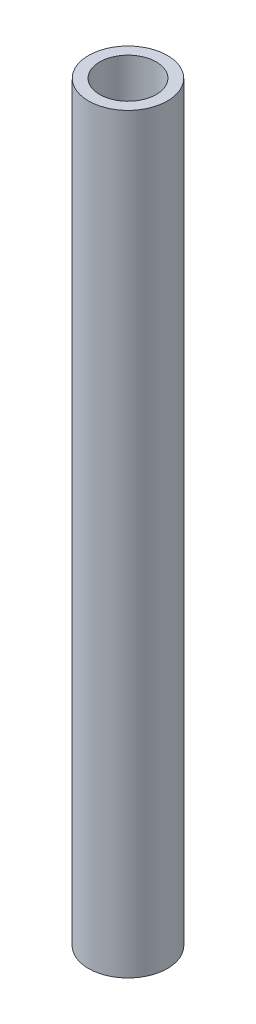
ISO-10303-21;
HEADER;
FILE_DESCRIPTION(('STEP AP214'),'2;1');
FILE_NAME('part.step','',(''),(''),'','','');
FILE_SCHEMA(('AUTOMOTIVE_DESIGN { 1 0 10303 214 1 1 1 1 }'));
ENDSEC;
DATA;
#1=APPLICATION_CONTEXT('core data for automotive mechanical design processes');
#2=APPLICATION_PROTOCOL_DEFINITION('international standard','automotive_design',2000,#1);
#3=PRODUCT_CONTEXT('',#1,'mechanical');
#4=PRODUCT('Part','Part','',(#3));
#5=PRODUCT_RELATED_PRODUCT_CATEGORY('part','',(#4));
#6=PRODUCT_DEFINITION_FORMATION('','',#4);
#7=PRODUCT_DEFINITION_CONTEXT('part definition',#1,'design');
#8=PRODUCT_DEFINITION('design','',#6,#7);
#9=PRODUCT_DEFINITION_SHAPE('','',#8);
#10=(LENGTH_UNIT() NAMED_UNIT(*) SI_UNIT(.MILLI.,.METRE.));
#11=(NAMED_UNIT(*) PLANE_ANGLE_UNIT() SI_UNIT($,.RADIAN.));
#12=(NAMED_UNIT(*) SI_UNIT($,.STERADIAN.) SOLID_ANGLE_UNIT());
#13=UNCERTAINTY_MEASURE_WITH_UNIT(LENGTH_MEASURE(1.E-05),#10,'distance_accuracy_value','');
#14=(GEOMETRIC_REPRESENTATION_CONTEXT(3) GLOBAL_UNCERTAINTY_ASSIGNED_CONTEXT((#13)) GLOBAL_UNIT_ASSIGNED_CONTEXT((#10,
#11,#12)) REPRESENTATION_CONTEXT('',''));
#15=CARTESIAN_POINT('',(0.,0.,0.));
#16=DIRECTION('',(0.,0.,1.));
#17=DIRECTION('',(1.,0.,0.));
#18=AXIS2_PLACEMENT_3D('',#15,#16,#17);
#19=CARTESIAN_POINT('',(0.,203.2,0.));
#20=DIRECTION('',(0.,1.,0.));
#21=DIRECTION('',(0.,0.,1.));
#22=AXIS2_PLACEMENT_3D('',#19,#20,#21);
#23=PLANE('',#22);
#24=CARTESIAN_POINT('',(0.,203.2,0.));
#25=DIRECTION('',(0.,1.,0.));
#26=DIRECTION('',(0.,0.,1.));
#27=AXIS2_PLACEMENT_3D('',#24,#25,#26);
#28=CIRCLE('',#27,10.668);
#29=CARTESIAN_POINT('',(0.,203.2,10.668));
#30=VERTEX_POINT('',#29);
#31=EDGE_CURVE('E10',#30,#30,#28,.T.);
#32=ORIENTED_EDGE('',*,*,#31,.T.);
#33=EDGE_LOOP('',(#32));
#34=FACE_BOUND('',#33,.T.);
#35=CARTESIAN_POINT('',(0.,203.2,0.));
#36=DIRECTION('',(0.,1.,0.));
#37=DIRECTION('',(0.,0.,1.));
#38=AXIS2_PLACEMENT_3D('',#35,#36,#37);
#39=CIRCLE('',#38,7.6454);
#40=CARTESIAN_POINT('',(0.,203.2,7.6454));
#41=VERTEX_POINT('',#40);
#42=EDGE_CURVE('E42',#41,#41,#39,.T.);
#43=ORIENTED_EDGE('',*,*,#42,.F.);
#44=EDGE_LOOP('',(#43));
#45=FACE_BOUND('',#44,.T.);
#46=ADVANCED_FACE('F31',(#34,#45),#23,.T.);
#47=CARTESIAN_POINT('',(0.,0.,0.));
#48=DIRECTION('',(0.,1.,0.));
#49=DIRECTION('',(0.,0.,1.));
#50=AXIS2_PLACEMENT_3D('',#47,#48,#49);
#51=PLANE('',#50);
#52=CARTESIAN_POINT('',(0.,0.,0.));
#53=DIRECTION('',(0.,1.,0.));
#54=DIRECTION('',(0.,0.,1.));
#55=AXIS2_PLACEMENT_3D('',#52,#53,#54);
#56=CIRCLE('',#55,10.668);
#57=CARTESIAN_POINT('',(0.,0.,10.668));
#58=VERTEX_POINT('',#57);
#59=EDGE_CURVE('E35',#58,#58,#56,.T.);
#60=ORIENTED_EDGE('',*,*,#59,.F.);
#61=EDGE_LOOP('',(#60));
#62=FACE_BOUND('',#61,.T.);
#63=CARTESIAN_POINT('',(0.,0.,0.));
#64=DIRECTION('',(0.,1.,0.));
#65=DIRECTION('',(0.,0.,1.));
#66=AXIS2_PLACEMENT_3D('',#63,#64,#65);
#67=CIRCLE('',#66,7.6454);
#68=CARTESIAN_POINT('',(0.,0.,7.6454));
#69=VERTEX_POINT('',#68);
#70=EDGE_CURVE('E44',#69,#69,#67,.T.);
#71=ORIENTED_EDGE('',*,*,#70,.T.);
#72=EDGE_LOOP('',(#71));
#73=FACE_BOUND('',#72,.T.);
#74=ADVANCED_FACE('F54',(#62,#73),#51,.F.);
#75=CARTESIAN_POINT('',(0.,203.2,0.));
#76=DIRECTION('',(0.,-1.,0.));
#77=DIRECTION('',(0.,0.,-1.));
#78=AXIS2_PLACEMENT_3D('',#75,#76,#77);
#79=CYLINDRICAL_SURFACE('',#78,10.668);
#80=ORIENTED_EDGE('',*,*,#31,.F.);
#81=EDGE_LOOP('',(#80));
#82=FACE_BOUND('',#81,.T.);
#83=ORIENTED_EDGE('',*,*,#59,.T.);
#84=EDGE_LOOP('',(#83));
#85=FACE_BOUND('',#84,.T.);
#86=ADVANCED_FACE('F33',(#82,#85),#79,.T.);
#87=CARTESIAN_POINT('',(0.,203.2,0.));
#88=DIRECTION('',(0.,-1.,0.));
#89=DIRECTION('',(0.,0.,-1.));
#90=AXIS2_PLACEMENT_3D('',#87,#88,#89);
#91=CYLINDRICAL_SURFACE('',#90,7.6454);
#92=ORIENTED_EDGE('',*,*,#42,.T.);
#93=EDGE_LOOP('',(#92));
#94=FACE_BOUND('',#93,.T.);
#95=ORIENTED_EDGE('',*,*,#70,.F.);
#96=EDGE_LOOP('',(#95));
#97=FACE_BOUND('',#96,.T.);
#98=ADVANCED_FACE('F50',(#94,#97),#91,.F.);
#99=CLOSED_SHELL('',(#46,#74,#86,#98));
#100=MANIFOLD_SOLID_BREP('B2',#99);
#101=ADVANCED_BREP_SHAPE_REPRESENTATION('',(#18,#100),#14);
#102=SHAPE_DEFINITION_REPRESENTATION(#9,#101);
ENDSEC;
END-ISO-10303-21;
